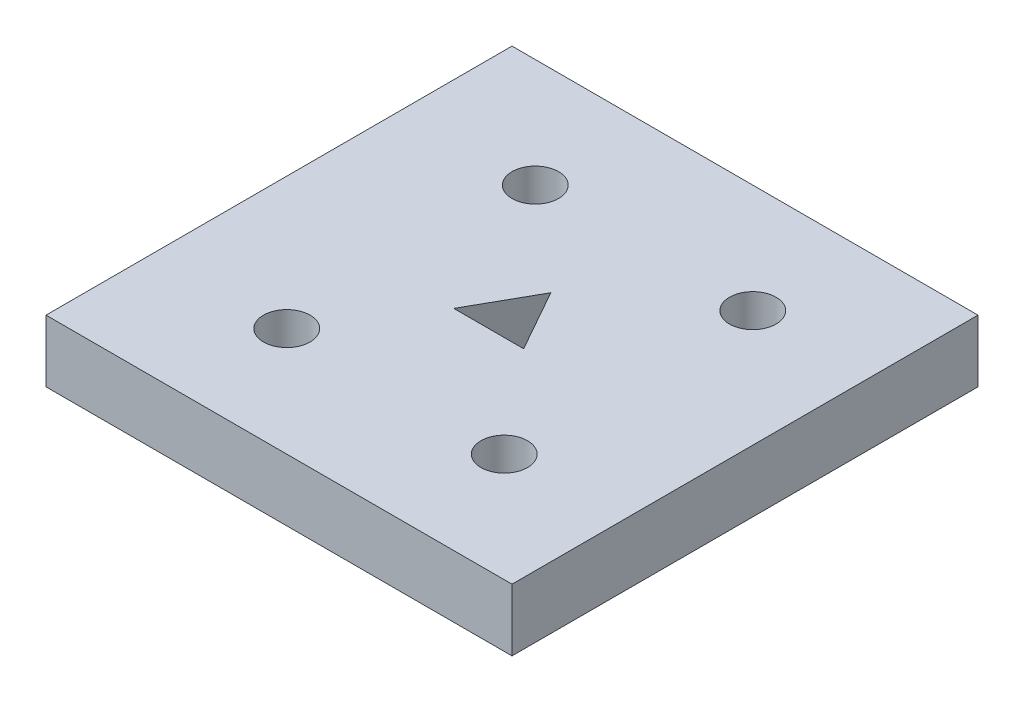
ISO-10303-21;
HEADER;
FILE_DESCRIPTION(('STEP AP214'),'2;1');
FILE_NAME('part.step','',(''),(''),'','','');
FILE_SCHEMA(('AUTOMOTIVE_DESIGN { 1 0 10303 214 1 1 1 1 }'));
ENDSEC;
DATA;
#1=APPLICATION_CONTEXT('core data for automotive mechanical design processes');
#2=APPLICATION_PROTOCOL_DEFINITION('international standard','automotive_design',2000,#1);
#3=PRODUCT_CONTEXT('',#1,'mechanical');
#4=PRODUCT('Part','Part','',(#3));
#5=PRODUCT_RELATED_PRODUCT_CATEGORY('part','',(#4));
#6=PRODUCT_DEFINITION_FORMATION('','',#4);
#7=PRODUCT_DEFINITION_CONTEXT('part definition',#1,'design');
#8=PRODUCT_DEFINITION('design','',#6,#7);
#9=PRODUCT_DEFINITION_SHAPE('','',#8);
#10=(LENGTH_UNIT() NAMED_UNIT(*) SI_UNIT(.MILLI.,.METRE.));
#11=(NAMED_UNIT(*) PLANE_ANGLE_UNIT() SI_UNIT($,.RADIAN.));
#12=(NAMED_UNIT(*) SI_UNIT($,.STERADIAN.) SOLID_ANGLE_UNIT());
#13=UNCERTAINTY_MEASURE_WITH_UNIT(LENGTH_MEASURE(1.E-05),#10,'distance_accuracy_value','');
#14=(GEOMETRIC_REPRESENTATION_CONTEXT(3) GLOBAL_UNCERTAINTY_ASSIGNED_CONTEXT((#13)) GLOBAL_UNIT_ASSIGNED_CONTEXT((#10,
#11,#12)) REPRESENTATION_CONTEXT('',''));
#15=CARTESIAN_POINT('',(0.,0.,0.));
#16=DIRECTION('',(0.,0.,1.));
#17=DIRECTION('',(1.,0.,0.));
#18=AXIS2_PLACEMENT_3D('',#15,#16,#17);
#19=CARTESIAN_POINT('',(0.,4.,0.));
#20=DIRECTION('',(0.,1.,0.));
#21=DIRECTION('',(0.,0.,1.));
#22=AXIS2_PLACEMENT_3D('',#19,#20,#21);
#23=PLANE('',#22);
#24=CARTESIAN_POINT('',(22.5,4.,23.));
#25=DIRECTION('',(0.,1.,0.));
#26=DIRECTION('',(0.,0.,-1.));
#27=AXIS2_PLACEMENT_3D('',#24,#25,#26);
#28=CIRCLE('',#27,1.5);
#29=CARTESIAN_POINT('',(22.5,4.,21.5));
#30=VERTEX_POINT('',#29);
#31=EDGE_CURVE('E121',#30,#30,#28,.T.);
#32=ORIENTED_EDGE('',*,*,#31,.F.);
#33=EDGE_LOOP('',(#32));
#34=FACE_BOUND('',#33,.T.);
#35=CARTESIAN_POINT('',(8.5,4.,7.));
#36=DIRECTION('',(0.,1.,0.));
#37=DIRECTION('',(0.,0.,1.));
#38=AXIS2_PLACEMENT_3D('',#35,#36,#37);
#39=CIRCLE('',#38,1.5);
#40=CARTESIAN_POINT('',(8.5,4.,8.5));
#41=VERTEX_POINT('',#40);
#42=EDGE_CURVE('E133',#41,#41,#39,.T.);
#43=ORIENTED_EDGE('',*,*,#42,.F.);
#44=EDGE_LOOP('',(#43));
#45=FACE_BOUND('',#44,.T.);
#46=DIRECTION('',(0.,0.,1.));
#47=VECTOR('',#46,1.);
#48=CARTESIAN_POINT('',(0.,4.,0.));
#49=LINE('',#48,#47);
#50=CARTESIAN_POINT('',(0.,4.,0.));
#51=VERTEX_POINT('',#50);
#52=CARTESIAN_POINT('',(0.,4.,30.));
#53=VERTEX_POINT('',#52);
#54=EDGE_CURVE('E139',#51,#53,#49,.T.);
#55=ORIENTED_EDGE('',*,*,#54,.T.);
#56=DIRECTION('',(1.,0.,0.));
#57=VECTOR('',#56,1.);
#58=CARTESIAN_POINT('',(0.,4.,30.));
#59=LINE('',#58,#57);
#60=CARTESIAN_POINT('',(30.,4.,30.));
#61=VERTEX_POINT('',#60);
#62=EDGE_CURVE('E142',#53,#61,#59,.T.);
#63=ORIENTED_EDGE('',*,*,#62,.T.);
#64=DIRECTION('',(0.,0.,-1.));
#65=VECTOR('',#64,1.);
#66=CARTESIAN_POINT('',(30.,4.,0.));
#67=LINE('',#66,#65);
#68=CARTESIAN_POINT('',(30.,4.,0.));
#69=VERTEX_POINT('',#68);
#70=EDGE_CURVE('E145',#61,#69,#67,.T.);
#71=ORIENTED_EDGE('',*,*,#70,.T.);
#72=DIRECTION('',(-1.,0.,0.));
#73=VECTOR('',#72,1.);
#74=CARTESIAN_POINT('',(0.,4.,0.));
#75=LINE('',#74,#73);
#76=EDGE_CURVE('E147',#69,#51,#75,.T.);
#77=ORIENTED_EDGE('',*,*,#76,.T.);
#78=EDGE_LOOP('',(#55,#63,#71,#77));
#79=FACE_BOUND('',#78,.T.);
#80=CARTESIAN_POINT('',(22.5,4.,7.));
#81=DIRECTION('',(0.,1.,0.));
#82=DIRECTION('',(0.,0.,1.));
#83=AXIS2_PLACEMENT_3D('',#80,#81,#82);
#84=CIRCLE('',#83,1.5);
#85=CARTESIAN_POINT('',(22.5,4.,8.5));
#86=VERTEX_POINT('',#85);
#87=EDGE_CURVE('E127',#86,#86,#84,.T.);
#88=ORIENTED_EDGE('',*,*,#87,.F.);
#89=EDGE_LOOP('',(#88));
#90=FACE_BOUND('',#89,.T.);
#91=DIRECTION('',(-0.490261239632559,0.,0.871575537124549));
#92=VECTOR('',#91,1.);
#93=CARTESIAN_POINT('',(15.,4.,12.5));
#94=LINE('',#93,#92);
#95=CARTESIAN_POINT('',(15.,4.,12.5));
#96=VERTEX_POINT('',#95);
#97=CARTESIAN_POINT('',(12.75,4.,16.5));
#98=VERTEX_POINT('',#97);
#99=EDGE_CURVE('E105',#96,#98,#94,.T.);
#100=ORIENTED_EDGE('',*,*,#99,.F.);
#101=DIRECTION('',(-0.490261239632559,0.,-0.871575537124549));
#102=VECTOR('',#101,1.);
#103=CARTESIAN_POINT('',(17.25,4.,16.5));
#104=LINE('',#103,#102);
#105=CARTESIAN_POINT('',(17.25,4.,16.5));
#106=VERTEX_POINT('',#105);
#107=EDGE_CURVE('E97',#106,#96,#104,.T.);
#108=ORIENTED_EDGE('',*,*,#107,.F.);
#109=DIRECTION('',(1.,0.,0.));
#110=VECTOR('',#109,1.);
#111=CARTESIAN_POINT('',(12.75,4.,16.5));
#112=LINE('',#111,#110);
#113=EDGE_CURVE('E115',#98,#106,#112,.T.);
#114=ORIENTED_EDGE('',*,*,#113,.F.);
#115=EDGE_LOOP('',(#100,#108,#114));
#116=FACE_BOUND('',#115,.T.);
#117=CARTESIAN_POINT('',(8.5,4.,23.));
#118=DIRECTION('',(0.,1.,0.));
#119=DIRECTION('',(0.,0.,-1.));
#120=AXIS2_PLACEMENT_3D('',#117,#118,#119);
#121=CIRCLE('',#120,1.5);
#122=CARTESIAN_POINT('',(8.5,4.,21.5));
#123=VERTEX_POINT('',#122);
#124=EDGE_CURVE('E241',#123,#123,#121,.T.);
#125=ORIENTED_EDGE('',*,*,#124,.F.);
#126=EDGE_LOOP('',(#125));
#127=FACE_BOUND('',#126,.T.);
#128=ADVANCED_FACE('F38',(#34,#45,#79,#90,#116,#127),#23,.T.);
#129=CARTESIAN_POINT('',(0.,0.,0.));
#130=DIRECTION('',(0.,1.,0.));
#131=DIRECTION('',(0.,0.,1.));
#132=AXIS2_PLACEMENT_3D('',#129,#130,#131);
#133=PLANE('',#132);
#134=CARTESIAN_POINT('',(22.5,0.,7.));
#135=DIRECTION('',(0.,1.,0.));
#136=DIRECTION('',(0.,0.,1.));
#137=AXIS2_PLACEMENT_3D('',#134,#135,#136);
#138=CIRCLE('',#137,1.5);
#139=CARTESIAN_POINT('',(22.5,0.,8.5));
#140=VERTEX_POINT('',#139);
#141=EDGE_CURVE('E112',#140,#140,#138,.T.);
#142=ORIENTED_EDGE('',*,*,#141,.T.);
#143=EDGE_LOOP('',(#142));
#144=FACE_BOUND('',#143,.T.);
#145=CARTESIAN_POINT('',(8.5,0.,7.));
#146=DIRECTION('',(0.,1.,0.));
#147=DIRECTION('',(0.,0.,1.));
#148=AXIS2_PLACEMENT_3D('',#145,#146,#147);
#149=CIRCLE('',#148,1.5);
#150=CARTESIAN_POINT('',(8.5,0.,8.5));
#151=VERTEX_POINT('',#150);
#152=EDGE_CURVE('E130',#151,#151,#149,.T.);
#153=ORIENTED_EDGE('',*,*,#152,.T.);
#154=EDGE_LOOP('',(#153));
#155=FACE_BOUND('',#154,.T.);
#156=DIRECTION('',(0.,0.,1.));
#157=VECTOR('',#156,1.);
#158=CARTESIAN_POINT('',(0.,0.,0.));
#159=LINE('',#158,#157);
#160=CARTESIAN_POINT('',(0.,0.,0.));
#161=VERTEX_POINT('',#160);
#162=CARTESIAN_POINT('',(0.,0.,30.));
#163=VERTEX_POINT('',#162);
#164=EDGE_CURVE('E136',#161,#163,#159,.T.);
#165=ORIENTED_EDGE('',*,*,#164,.F.);
#166=DIRECTION('',(-1.,0.,0.));
#167=VECTOR('',#166,1.);
#168=CARTESIAN_POINT('',(0.,0.,0.));
#169=LINE('',#168,#167);
#170=CARTESIAN_POINT('',(30.,0.,0.));
#171=VERTEX_POINT('',#170);
#172=EDGE_CURVE('E143',#171,#161,#169,.T.);
#173=ORIENTED_EDGE('',*,*,#172,.F.);
#174=DIRECTION('',(0.,0.,-1.));
#175=VECTOR('',#174,1.);
#176=CARTESIAN_POINT('',(30.,0.,0.));
#177=LINE('',#176,#175);
#178=CARTESIAN_POINT('',(30.,0.,30.));
#179=VERTEX_POINT('',#178);
#180=EDGE_CURVE('E154',#179,#171,#177,.T.);
#181=ORIENTED_EDGE('',*,*,#180,.F.);
#182=DIRECTION('',(1.,0.,0.));
#183=VECTOR('',#182,1.);
#184=CARTESIAN_POINT('',(0.,0.,30.));
#185=LINE('',#184,#183);
#186=EDGE_CURVE('E152',#163,#179,#185,.T.);
#187=ORIENTED_EDGE('',*,*,#186,.F.);
#188=EDGE_LOOP('',(#165,#173,#181,#187));
#189=FACE_BOUND('',#188,.T.);
#190=DIRECTION('',(-0.490261239632559,0.,-0.871575537124549));
#191=VECTOR('',#190,1.);
#192=CARTESIAN_POINT('',(17.25,0.,16.5));
#193=LINE('',#192,#191);
#194=CARTESIAN_POINT('',(17.25,0.,16.5));
#195=VERTEX_POINT('',#194);
#196=CARTESIAN_POINT('',(15.,0.,12.5));
#197=VERTEX_POINT('',#196);
#198=EDGE_CURVE('E61',#195,#197,#193,.T.);
#199=ORIENTED_EDGE('',*,*,#198,.T.);
#200=DIRECTION('',(-0.490261239632559,0.,0.871575537124549));
#201=VECTOR('',#200,1.);
#202=CARTESIAN_POINT('',(15.,0.,12.5));
#203=LINE('',#202,#201);
#204=CARTESIAN_POINT('',(12.75,0.,16.5));
#205=VERTEX_POINT('',#204);
#206=EDGE_CURVE('E111',#197,#205,#203,.T.);
#207=ORIENTED_EDGE('',*,*,#206,.T.);
#208=DIRECTION('',(1.,0.,0.));
#209=VECTOR('',#208,1.);
#210=CARTESIAN_POINT('',(12.75,0.,16.5));
#211=LINE('',#210,#209);
#212=EDGE_CURVE('E106',#205,#195,#211,.T.);
#213=ORIENTED_EDGE('',*,*,#212,.T.);
#214=EDGE_LOOP('',(#199,#207,#213));
#215=FACE_BOUND('',#214,.T.);
#216=CARTESIAN_POINT('',(22.5,0.,23.));
#217=DIRECTION('',(0.,1.,0.));
#218=DIRECTION('',(0.,0.,-1.));
#219=AXIS2_PLACEMENT_3D('',#216,#217,#218);
#220=CIRCLE('',#219,1.5);
#221=CARTESIAN_POINT('',(22.5,0.,21.5));
#222=VERTEX_POINT('',#221);
#223=EDGE_CURVE('E247',#222,#222,#220,.T.);
#224=ORIENTED_EDGE('',*,*,#223,.T.);
#225=EDGE_LOOP('',(#224));
#226=FACE_BOUND('',#225,.T.);
#227=CARTESIAN_POINT('',(8.5,0.,23.));
#228=DIRECTION('',(0.,1.,0.));
#229=DIRECTION('',(0.,0.,-1.));
#230=AXIS2_PLACEMENT_3D('',#227,#228,#229);
#231=CIRCLE('',#230,1.5);
#232=CARTESIAN_POINT('',(8.5,0.,21.5));
#233=VERTEX_POINT('',#232);
#234=EDGE_CURVE('E244',#233,#233,#231,.T.);
#235=ORIENTED_EDGE('',*,*,#234,.T.);
#236=EDGE_LOOP('',(#235));
#237=FACE_BOUND('',#236,.T.);
#238=ADVANCED_FACE('F172',(#144,#155,#189,#215,#226,#237),#133,.F.);
#239=CARTESIAN_POINT('',(0.,4.,0.));
#240=DIRECTION('',(1.,0.,0.));
#241=DIRECTION('',(0.,0.,-1.));
#242=AXIS2_PLACEMENT_3D('',#239,#240,#241);
#243=PLANE('',#242);
#244=ORIENTED_EDGE('',*,*,#164,.T.);
#245=DIRECTION('',(0.,-1.,0.));
#246=VECTOR('',#245,1.);
#247=CARTESIAN_POINT('',(0.,4.,30.));
#248=LINE('',#247,#246);
#249=EDGE_CURVE('E11',#53,#163,#248,.T.);
#250=ORIENTED_EDGE('',*,*,#249,.F.);
#251=ORIENTED_EDGE('',*,*,#54,.F.);
#252=DIRECTION('',(0.,-1.,0.));
#253=VECTOR('',#252,1.);
#254=CARTESIAN_POINT('',(0.,4.,0.));
#255=LINE('',#254,#253);
#256=EDGE_CURVE('E149',#51,#161,#255,.T.);
#257=ORIENTED_EDGE('',*,*,#256,.T.);
#258=EDGE_LOOP('',(#244,#250,#251,#257));
#259=FACE_BOUND('',#258,.T.);
#260=ADVANCED_FACE('F40',(#259),#243,.F.);
#261=CARTESIAN_POINT('',(0.,4.,30.));
#262=DIRECTION('',(0.,0.,-1.));
#263=DIRECTION('',(-1.,0.,0.));
#264=AXIS2_PLACEMENT_3D('',#261,#262,#263);
#265=PLANE('',#264);
#266=ORIENTED_EDGE('',*,*,#186,.T.);
#267=DIRECTION('',(0.,-1.,0.));
#268=VECTOR('',#267,1.);
#269=CARTESIAN_POINT('',(30.,4.,30.));
#270=LINE('',#269,#268);
#271=EDGE_CURVE('E46',#61,#179,#270,.T.);
#272=ORIENTED_EDGE('',*,*,#271,.F.);
#273=ORIENTED_EDGE('',*,*,#62,.F.);
#274=ORIENTED_EDGE('',*,*,#249,.T.);
#275=EDGE_LOOP('',(#266,#272,#273,#274));
#276=FACE_BOUND('',#275,.T.);
#277=ADVANCED_FACE('F183',(#276),#265,.F.);
#278=CARTESIAN_POINT('',(30.,4.,0.));
#279=DIRECTION('',(-1.,0.,0.));
#280=DIRECTION('',(0.,0.,1.));
#281=AXIS2_PLACEMENT_3D('',#278,#279,#280);
#282=PLANE('',#281);
#283=ORIENTED_EDGE('',*,*,#180,.T.);
#284=DIRECTION('',(0.,-1.,0.));
#285=VECTOR('',#284,1.);
#286=CARTESIAN_POINT('',(30.,4.,0.));
#287=LINE('',#286,#285);
#288=EDGE_CURVE('E159',#69,#171,#287,.T.);
#289=ORIENTED_EDGE('',*,*,#288,.F.);
#290=ORIENTED_EDGE('',*,*,#70,.F.);
#291=ORIENTED_EDGE('',*,*,#271,.T.);
#292=EDGE_LOOP('',(#283,#289,#290,#291));
#293=FACE_BOUND('',#292,.T.);
#294=ADVANCED_FACE('F166',(#293),#282,.F.);
#295=CARTESIAN_POINT('',(0.,4.,0.));
#296=DIRECTION('',(0.,0.,1.));
#297=DIRECTION('',(1.,0.,0.));
#298=AXIS2_PLACEMENT_3D('',#295,#296,#297);
#299=PLANE('',#298);
#300=ORIENTED_EDGE('',*,*,#172,.T.);
#301=ORIENTED_EDGE('',*,*,#256,.F.);
#302=ORIENTED_EDGE('',*,*,#76,.F.);
#303=ORIENTED_EDGE('',*,*,#288,.T.);
#304=EDGE_LOOP('',(#300,#301,#302,#303));
#305=FACE_BOUND('',#304,.T.);
#306=ADVANCED_FACE('F176',(#305),#299,.F.);
#307=CARTESIAN_POINT('',(8.5,4.,7.));
#308=DIRECTION('',(0.,-1.,0.));
#309=DIRECTION('',(0.,0.,-1.));
#310=AXIS2_PLACEMENT_3D('',#307,#308,#309);
#311=CYLINDRICAL_SURFACE('',#310,1.5);
#312=ORIENTED_EDGE('',*,*,#42,.T.);
#313=EDGE_LOOP('',(#312));
#314=FACE_BOUND('',#313,.T.);
#315=ORIENTED_EDGE('',*,*,#152,.F.);
#316=EDGE_LOOP('',(#315));
#317=FACE_BOUND('',#316,.T.);
#318=ADVANCED_FACE('F201',(#314,#317),#311,.F.);
#319=CARTESIAN_POINT('',(22.5,4.,7.));
#320=DIRECTION('',(0.,-1.,0.));
#321=DIRECTION('',(0.,0.,-1.));
#322=AXIS2_PLACEMENT_3D('',#319,#320,#321);
#323=CYLINDRICAL_SURFACE('',#322,1.5);
#324=ORIENTED_EDGE('',*,*,#87,.T.);
#325=EDGE_LOOP('',(#324));
#326=FACE_BOUND('',#325,.T.);
#327=ORIENTED_EDGE('',*,*,#141,.F.);
#328=EDGE_LOOP('',(#327));
#329=FACE_BOUND('',#328,.T.);
#330=ADVANCED_FACE('F208',(#326,#329),#323,.F.);
#331=CARTESIAN_POINT('',(17.25,4.,16.5));
#332=DIRECTION('',(-0.871575537124549,0.,0.490261239632559));
#333=DIRECTION('',(0.490261239632559,0.,0.871575537124549));
#334=AXIS2_PLACEMENT_3D('',#331,#332,#333);
#335=PLANE('',#334);
#336=ORIENTED_EDGE('',*,*,#198,.F.);
#337=DIRECTION('',(0.,-1.,0.));
#338=VECTOR('',#337,1.);
#339=CARTESIAN_POINT('',(17.25,4.,16.5));
#340=LINE('',#339,#338);
#341=EDGE_CURVE('E101',#106,#195,#340,.T.);
#342=ORIENTED_EDGE('',*,*,#341,.F.);
#343=ORIENTED_EDGE('',*,*,#107,.T.);
#344=DIRECTION('',(0.,-1.,0.));
#345=VECTOR('',#344,1.);
#346=CARTESIAN_POINT('',(15.,4.,12.5));
#347=LINE('',#346,#345);
#348=EDGE_CURVE('E100',#96,#197,#347,.T.);
#349=ORIENTED_EDGE('',*,*,#348,.T.);
#350=EDGE_LOOP('',(#336,#342,#343,#349));
#351=FACE_BOUND('',#350,.T.);
#352=ADVANCED_FACE('F99',(#351),#335,.T.);
#353=CARTESIAN_POINT('',(15.,4.,12.5));
#354=DIRECTION('',(0.871575537124549,0.,0.490261239632559));
#355=DIRECTION('',(0.490261239632559,0.,-0.871575537124549));
#356=AXIS2_PLACEMENT_3D('',#353,#354,#355);
#357=PLANE('',#356);
#358=ORIENTED_EDGE('',*,*,#206,.F.);
#359=ORIENTED_EDGE('',*,*,#348,.F.);
#360=ORIENTED_EDGE('',*,*,#99,.T.);
#361=DIRECTION('',(0.,-1.,0.));
#362=VECTOR('',#361,1.);
#363=CARTESIAN_POINT('',(12.75,4.,16.5));
#364=LINE('',#363,#362);
#365=EDGE_CURVE('E53',#98,#205,#364,.T.);
#366=ORIENTED_EDGE('',*,*,#365,.T.);
#367=EDGE_LOOP('',(#358,#359,#360,#366));
#368=FACE_BOUND('',#367,.T.);
#369=ADVANCED_FACE('F109',(#368),#357,.T.);
#370=CARTESIAN_POINT('',(12.75,4.,16.5));
#371=DIRECTION('',(0.,0.,-1.));
#372=DIRECTION('',(-1.,0.,0.));
#373=AXIS2_PLACEMENT_3D('',#370,#371,#372);
#374=PLANE('',#373);
#375=ORIENTED_EDGE('',*,*,#212,.F.);
#376=ORIENTED_EDGE('',*,*,#365,.F.);
#377=ORIENTED_EDGE('',*,*,#113,.T.);
#378=ORIENTED_EDGE('',*,*,#341,.T.);
#379=EDGE_LOOP('',(#375,#376,#377,#378));
#380=FACE_BOUND('',#379,.T.);
#381=ADVANCED_FACE('F226',(#380),#374,.T.);
#382=CARTESIAN_POINT('',(22.5,4.,23.));
#383=DIRECTION('',(0.,-1.,0.));
#384=DIRECTION('',(0.,0.,-1.));
#385=AXIS2_PLACEMENT_3D('',#382,#383,#384);
#386=CYLINDRICAL_SURFACE('',#385,1.5);
#387=ORIENTED_EDGE('',*,*,#31,.T.);
#388=EDGE_LOOP('',(#387));
#389=FACE_BOUND('',#388,.T.);
#390=ORIENTED_EDGE('',*,*,#223,.F.);
#391=EDGE_LOOP('',(#390));
#392=FACE_BOUND('',#391,.T.);
#393=ADVANCED_FACE('F229',(#389,#392),#386,.F.);
#394=CARTESIAN_POINT('',(8.5,4.,23.));
#395=DIRECTION('',(0.,-1.,0.));
#396=DIRECTION('',(0.,0.,-1.));
#397=AXIS2_PLACEMENT_3D('',#394,#395,#396);
#398=CYLINDRICAL_SURFACE('',#397,1.5);
#399=ORIENTED_EDGE('',*,*,#124,.T.);
#400=EDGE_LOOP('',(#399));
#401=FACE_BOUND('',#400,.T.);
#402=ORIENTED_EDGE('',*,*,#234,.F.);
#403=EDGE_LOOP('',(#402));
#404=FACE_BOUND('',#403,.T.);
#405=ADVANCED_FACE('F232',(#401,#404),#398,.F.);
#406=CLOSED_SHELL('',(#128,#238,#260,#277,#294,#306,#318,#330,#352,#369,#381,#393,#405));
#407=MANIFOLD_SOLID_BREP('B2',#406);
#408=ADVANCED_BREP_SHAPE_REPRESENTATION('',(#18,#407),#14);
#409=SHAPE_DEFINITION_REPRESENTATION(#9,#408);
ENDSEC;
END-ISO-10303-21;
